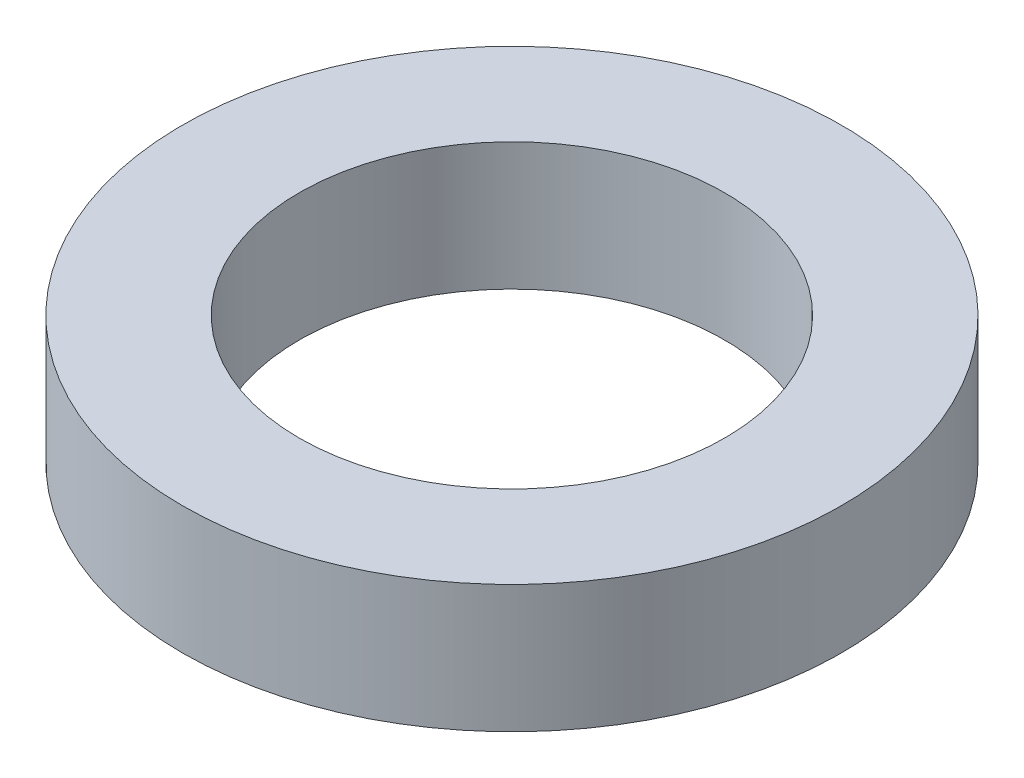
ISO-10303-21;
HEADER;
FILE_DESCRIPTION(('STEP AP214'),'2;1');
FILE_NAME('part.step','',(''),(''),'','','');
FILE_SCHEMA(('AUTOMOTIVE_DESIGN { 1 0 10303 214 1 1 1 1 }'));
ENDSEC;
DATA;
#1=APPLICATION_CONTEXT('core data for automotive mechanical design processes');
#2=APPLICATION_PROTOCOL_DEFINITION('international standard','automotive_design',2000,#1);
#3=PRODUCT_CONTEXT('',#1,'mechanical');
#4=PRODUCT('Part','Part','',(#3));
#5=PRODUCT_RELATED_PRODUCT_CATEGORY('part','',(#4));
#6=PRODUCT_DEFINITION_FORMATION('','',#4);
#7=PRODUCT_DEFINITION_CONTEXT('part definition',#1,'design');
#8=PRODUCT_DEFINITION('design','',#6,#7);
#9=PRODUCT_DEFINITION_SHAPE('','',#8);
#10=(LENGTH_UNIT() NAMED_UNIT(*) SI_UNIT(.MILLI.,.METRE.));
#11=(NAMED_UNIT(*) PLANE_ANGLE_UNIT() SI_UNIT($,.RADIAN.));
#12=(NAMED_UNIT(*) SI_UNIT($,.STERADIAN.) SOLID_ANGLE_UNIT());
#13=UNCERTAINTY_MEASURE_WITH_UNIT(LENGTH_MEASURE(1.E-05),#10,'distance_accuracy_value','');
#14=(GEOMETRIC_REPRESENTATION_CONTEXT(3) GLOBAL_UNCERTAINTY_ASSIGNED_CONTEXT((#13)) GLOBAL_UNIT_ASSIGNED_CONTEXT((#10,
#11,#12)) REPRESENTATION_CONTEXT('',''));
#15=CARTESIAN_POINT('',(0.,0.,0.));
#16=DIRECTION('',(0.,0.,1.));
#17=DIRECTION('',(1.,0.,0.));
#18=AXIS2_PLACEMENT_3D('',#15,#16,#17);
#19=CARTESIAN_POINT('',(0.,12.,0.));
#20=DIRECTION('',(0.,1.,0.));
#21=DIRECTION('',(0.,0.,1.));
#22=AXIS2_PLACEMENT_3D('',#19,#20,#21);
#23=PLANE('',#22);
#24=CARTESIAN_POINT('',(0.,12.,0.));
#25=DIRECTION('',(0.,1.,0.));
#26=DIRECTION('',(0.,0.,1.));
#27=AXIS2_PLACEMENT_3D('',#24,#25,#26);
#28=CIRCLE('',#27,31.);
#29=CARTESIAN_POINT('',(0.,12.,31.));
#30=VERTEX_POINT('',#29);
#31=EDGE_CURVE('E10',#30,#30,#28,.T.);
#32=ORIENTED_EDGE('',*,*,#31,.T.);
#33=EDGE_LOOP('',(#32));
#34=FACE_BOUND('',#33,.T.);
#35=CARTESIAN_POINT('',(0.,12.,0.));
#36=DIRECTION('',(0.,1.,0.));
#37=DIRECTION('',(0.,0.,1.));
#38=AXIS2_PLACEMENT_3D('',#35,#36,#37);
#39=CIRCLE('',#38,20.);
#40=CARTESIAN_POINT('',(0.,12.,20.));
#41=VERTEX_POINT('',#40);
#42=EDGE_CURVE('E58',#41,#41,#39,.T.);
#43=ORIENTED_EDGE('',*,*,#42,.F.);
#44=EDGE_LOOP('',(#43));
#45=FACE_BOUND('',#44,.T.);
#46=ADVANCED_FACE('F45',(#34,#45),#23,.T.);
#47=CARTESIAN_POINT('',(0.,0.,0.));
#48=DIRECTION('',(0.,1.,0.));
#49=DIRECTION('',(0.,0.,1.));
#50=AXIS2_PLACEMENT_3D('',#47,#48,#49);
#51=PLANE('',#50);
#52=CARTESIAN_POINT('',(0.,0.,0.));
#53=DIRECTION('',(0.,1.,0.));
#54=DIRECTION('',(0.,0.,1.));
#55=AXIS2_PLACEMENT_3D('',#52,#53,#54);
#56=CIRCLE('',#55,31.);
#57=CARTESIAN_POINT('',(0.,0.,31.));
#58=VERTEX_POINT('',#57);
#59=EDGE_CURVE('E49',#58,#58,#56,.T.);
#60=ORIENTED_EDGE('',*,*,#59,.F.);
#61=EDGE_LOOP('',(#60));
#62=FACE_BOUND('',#61,.T.);
#63=CARTESIAN_POINT('',(0.,0.,0.));
#64=DIRECTION('',(0.,1.,0.));
#65=DIRECTION('',(0.,0.,1.));
#66=AXIS2_PLACEMENT_3D('',#63,#64,#65);
#67=CIRCLE('',#66,20.);
#68=CARTESIAN_POINT('',(0.,0.,20.));
#69=VERTEX_POINT('',#68);
#70=EDGE_CURVE('E60',#69,#69,#67,.T.);
#71=ORIENTED_EDGE('',*,*,#70,.T.);
#72=EDGE_LOOP('',(#71));
#73=FACE_BOUND('',#72,.T.);
#74=ADVANCED_FACE('F72',(#62,#73),#51,.F.);
#75=CARTESIAN_POINT('',(0.,12.,0.));
#76=DIRECTION('',(0.,-1.,0.));
#77=DIRECTION('',(0.,0.,-1.));
#78=AXIS2_PLACEMENT_3D('',#75,#76,#77);
#79=CYLINDRICAL_SURFACE('',#78,31.);
#80=ORIENTED_EDGE('',*,*,#31,.F.);
#81=EDGE_LOOP('',(#80));
#82=FACE_BOUND('',#81,.T.);
#83=ORIENTED_EDGE('',*,*,#59,.T.);
#84=EDGE_LOOP('',(#83));
#85=FACE_BOUND('',#84,.T.);
#86=ADVANCED_FACE('F47',(#82,#85),#79,.T.);
#87=CARTESIAN_POINT('',(0.,12.,0.));
#88=DIRECTION('',(0.,-1.,0.));
#89=DIRECTION('',(0.,0.,-1.));
#90=AXIS2_PLACEMENT_3D('',#87,#88,#89);
#91=CYLINDRICAL_SURFACE('',#90,20.);
#92=ORIENTED_EDGE('',*,*,#42,.T.);
#93=EDGE_LOOP('',(#92));
#94=FACE_BOUND('',#93,.T.);
#95=ORIENTED_EDGE('',*,*,#70,.F.);
#96=EDGE_LOOP('',(#95));
#97=FACE_BOUND('',#96,.T.);
#98=ADVANCED_FACE('F68',(#94,#97),#91,.F.);
#99=CLOSED_SHELL('',(#46,#74,#86,#98));
#100=MANIFOLD_SOLID_BREP('B2',#99);
#101=ADVANCED_BREP_SHAPE_REPRESENTATION('',(#18,#100),#14);
#102=SHAPE_DEFINITION_REPRESENTATION(#9,#101);
ENDSEC;
END-ISO-10303-21;
